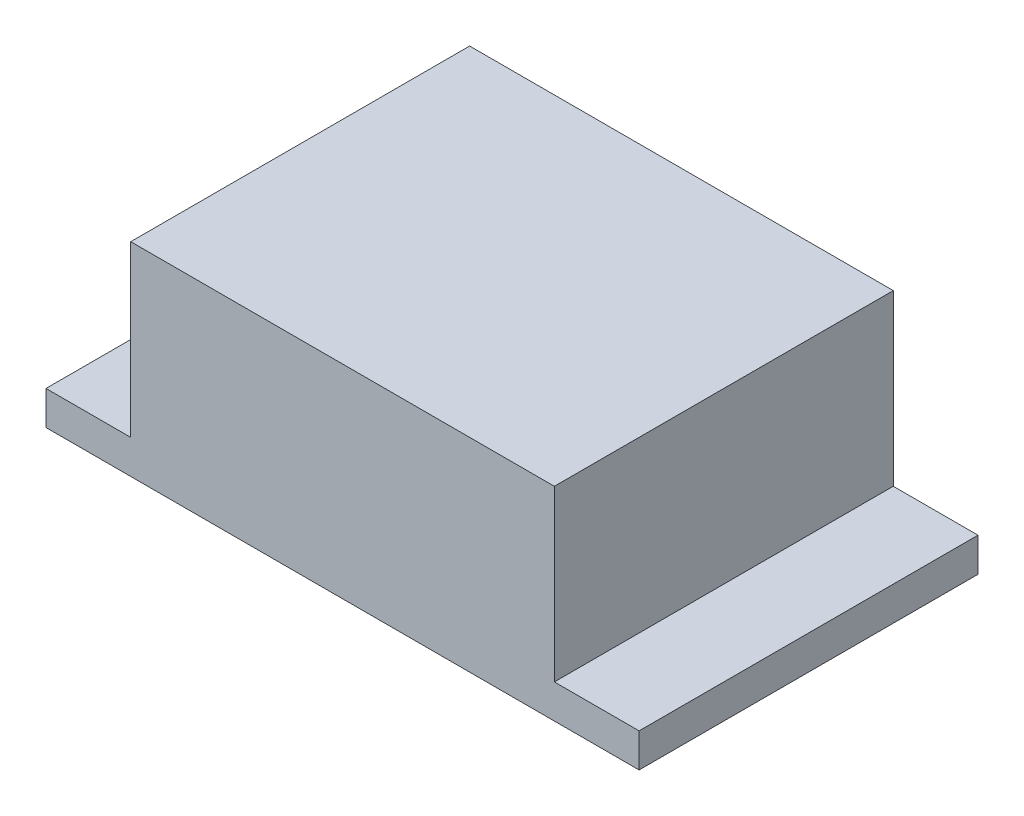
ISO-10303-21;
HEADER;
FILE_DESCRIPTION(('STEP AP214'),'2;1');
FILE_NAME('part.step','',(''),(''),'','','');
FILE_SCHEMA(('AUTOMOTIVE_DESIGN { 1 0 10303 214 1 1 1 1 }'));
ENDSEC;
DATA;
#1=APPLICATION_CONTEXT('core data for automotive mechanical design processes');
#2=APPLICATION_PROTOCOL_DEFINITION('international standard','automotive_design',2000,#1);
#3=PRODUCT_CONTEXT('',#1,'mechanical');
#4=PRODUCT('Part','Part','',(#3));
#5=PRODUCT_RELATED_PRODUCT_CATEGORY('part','',(#4));
#6=PRODUCT_DEFINITION_FORMATION('','',#4);
#7=PRODUCT_DEFINITION_CONTEXT('part definition',#1,'design');
#8=PRODUCT_DEFINITION('design','',#6,#7);
#9=PRODUCT_DEFINITION_SHAPE('','',#8);
#10=(LENGTH_UNIT() NAMED_UNIT(*) SI_UNIT(.MILLI.,.METRE.));
#11=(NAMED_UNIT(*) PLANE_ANGLE_UNIT() SI_UNIT($,.RADIAN.));
#12=(NAMED_UNIT(*) SI_UNIT($,.STERADIAN.) SOLID_ANGLE_UNIT());
#13=UNCERTAINTY_MEASURE_WITH_UNIT(LENGTH_MEASURE(1.E-05),#10,'distance_accuracy_value','');
#14=(GEOMETRIC_REPRESENTATION_CONTEXT(3) GLOBAL_UNCERTAINTY_ASSIGNED_CONTEXT((#13)) GLOBAL_UNIT_ASSIGNED_CONTEXT((#10,
#11,#12)) REPRESENTATION_CONTEXT('',''));
#15=CARTESIAN_POINT('',(0.,0.,0.));
#16=DIRECTION('',(0.,0.,1.));
#17=DIRECTION('',(1.,0.,0.));
#18=AXIS2_PLACEMENT_3D('',#15,#16,#17);
#19=CARTESIAN_POINT('',(0.,2.,0.));
#20=DIRECTION('',(0.,1.,0.));
#21=DIRECTION('',(0.,0.,1.));
#22=AXIS2_PLACEMENT_3D('',#19,#20,#21);
#23=PLANE('',#22);
#24=DIRECTION('',(0.,0.,-1.));
#25=VECTOR('',#24,1.);
#26=CARTESIAN_POINT('',(12.5,2.,-10.));
#27=LINE('',#26,#25);
#28=CARTESIAN_POINT('',(12.5,2.,10.));
#29=VERTEX_POINT('',#28);
#30=CARTESIAN_POINT('',(12.5,2.,-10.));
#31=VERTEX_POINT('',#30);
#32=EDGE_CURVE('E54',#29,#31,#27,.T.);
#33=ORIENTED_EDGE('',*,*,#32,.F.);
#34=DIRECTION('',(1.,0.,0.));
#35=VECTOR('',#34,1.);
#36=CARTESIAN_POINT('',(-17.5,2.,10.));
#37=LINE('',#36,#35);
#38=CARTESIAN_POINT('',(17.5,2.,10.));
#39=VERTEX_POINT('',#38);
#40=EDGE_CURVE('E143',#29,#39,#37,.T.);
#41=ORIENTED_EDGE('',*,*,#40,.T.);
#42=DIRECTION('',(0.,0.,-1.));
#43=VECTOR('',#42,1.);
#44=CARTESIAN_POINT('',(17.5,2.,-10.));
#45=LINE('',#44,#43);
#46=CARTESIAN_POINT('',(17.5,2.,-10.));
#47=VERTEX_POINT('',#46);
#48=EDGE_CURVE('E134',#39,#47,#45,.T.);
#49=ORIENTED_EDGE('',*,*,#48,.T.);
#50=DIRECTION('',(-1.,0.,0.));
#51=VECTOR('',#50,1.);
#52=CARTESIAN_POINT('',(-17.5,2.,-10.));
#53=LINE('',#52,#51);
#54=EDGE_CURVE('E139',#47,#31,#53,.T.);
#55=ORIENTED_EDGE('',*,*,#54,.T.);
#56=EDGE_LOOP('',(#33,#41,#49,#55));
#57=FACE_BOUND('',#56,.T.);
#58=ADVANCED_FACE('F39',(#57),#23,.T.);
#59=CARTESIAN_POINT('',(17.5,2.,-10.));
#60=DIRECTION('',(-1.,0.,0.));
#61=DIRECTION('',(0.,0.,1.));
#62=AXIS2_PLACEMENT_3D('',#59,#60,#61);
#63=PLANE('',#62);
#64=DIRECTION('',(0.,0.,-1.));
#65=VECTOR('',#64,1.);
#66=CARTESIAN_POINT('',(17.5,0.,-10.));
#67=LINE('',#66,#65);
#68=CARTESIAN_POINT('',(17.5,0.,10.));
#69=VERTEX_POINT('',#68);
#70=CARTESIAN_POINT('',(17.5,0.,-10.));
#71=VERTEX_POINT('',#70);
#72=EDGE_CURVE('E125',#69,#71,#67,.T.);
#73=ORIENTED_EDGE('',*,*,#72,.T.);
#74=DIRECTION('',(0.,-1.,0.));
#75=VECTOR('',#74,1.);
#76=CARTESIAN_POINT('',(17.5,2.,-10.));
#77=LINE('',#76,#75);
#78=EDGE_CURVE('E11',#47,#71,#77,.T.);
#79=ORIENTED_EDGE('',*,*,#78,.F.);
#80=ORIENTED_EDGE('',*,*,#48,.F.);
#81=DIRECTION('',(0.,-1.,0.));
#82=VECTOR('',#81,1.);
#83=CARTESIAN_POINT('',(17.5,2.,10.));
#84=LINE('',#83,#82);
#85=EDGE_CURVE('E145',#39,#69,#84,.T.);
#86=ORIENTED_EDGE('',*,*,#85,.T.);
#87=EDGE_LOOP('',(#73,#79,#80,#86));
#88=FACE_BOUND('',#87,.T.);
#89=ADVANCED_FACE('F41',(#88),#63,.F.);
#90=CARTESIAN_POINT('',(-17.5,2.,-10.));
#91=DIRECTION('',(0.,0.,1.));
#92=DIRECTION('',(1.,0.,0.));
#93=AXIS2_PLACEMENT_3D('',#90,#91,#92);
#94=PLANE('',#93);
#95=DIRECTION('',(-1.,0.,0.));
#96=VECTOR('',#95,1.);
#97=CARTESIAN_POINT('',(-17.5,0.,-10.));
#98=LINE('',#97,#96);
#99=CARTESIAN_POINT('',(-17.5,0.,-10.));
#100=VERTEX_POINT('',#99);
#101=EDGE_CURVE('E128',#71,#100,#98,.T.);
#102=ORIENTED_EDGE('',*,*,#101,.T.);
#103=DIRECTION('',(0.,-1.,0.));
#104=VECTOR('',#103,1.);
#105=CARTESIAN_POINT('',(-17.5,2.,-10.));
#106=LINE('',#105,#104);
#107=CARTESIAN_POINT('',(-17.5,2.,-10.));
#108=VERTEX_POINT('',#107);
#109=EDGE_CURVE('E47',#108,#100,#106,.T.);
#110=ORIENTED_EDGE('',*,*,#109,.F.);
#111=CARTESIAN_POINT('',(-12.5,2.,-10.));
#112=VERTEX_POINT('',#111);
#113=EDGE_CURVE('E137',#112,#108,#53,.T.);
#114=ORIENTED_EDGE('',*,*,#113,.F.);
#115=DIRECTION('',(0.,-1.,0.));
#116=VECTOR('',#115,1.);
#117=CARTESIAN_POINT('',(-12.5,12.,-10.));
#118=LINE('',#117,#116);
#119=CARTESIAN_POINT('',(-12.5,12.,-10.));
#120=VERTEX_POINT('',#119);
#121=EDGE_CURVE('E110',#120,#112,#118,.T.);
#122=ORIENTED_EDGE('',*,*,#121,.F.);
#123=DIRECTION('',(-1.,0.,0.));
#124=VECTOR('',#123,1.);
#125=CARTESIAN_POINT('',(-12.5,12.,-10.));
#126=LINE('',#125,#124);
#127=CARTESIAN_POINT('',(12.5,12.,-10.));
#128=VERTEX_POINT('',#127);
#129=EDGE_CURVE('E104',#128,#120,#126,.T.);
#130=ORIENTED_EDGE('',*,*,#129,.F.);
#131=DIRECTION('',(0.,-1.,0.));
#132=VECTOR('',#131,1.);
#133=CARTESIAN_POINT('',(12.5,12.,-10.));
#134=LINE('',#133,#132);
#135=EDGE_CURVE('E108',#128,#31,#134,.T.);
#136=ORIENTED_EDGE('',*,*,#135,.T.);
#137=ORIENTED_EDGE('',*,*,#54,.F.);
#138=ORIENTED_EDGE('',*,*,#78,.T.);
#139=EDGE_LOOP('',(#102,#110,#114,#122,#130,#136,#137,#138));
#140=FACE_BOUND('',#139,.T.);
#141=ADVANCED_FACE('F106',(#140),#94,.F.);
#142=CARTESIAN_POINT('',(-17.5,2.,-10.));
#143=DIRECTION('',(1.,0.,0.));
#144=DIRECTION('',(0.,0.,-1.));
#145=AXIS2_PLACEMENT_3D('',#142,#143,#144);
#146=PLANE('',#145);
#147=DIRECTION('',(0.,0.,1.));
#148=VECTOR('',#147,1.);
#149=CARTESIAN_POINT('',(-17.5,0.,-10.));
#150=LINE('',#149,#148);
#151=CARTESIAN_POINT('',(-17.5,0.,10.));
#152=VERTEX_POINT('',#151);
#153=EDGE_CURVE('E148',#100,#152,#150,.T.);
#154=ORIENTED_EDGE('',*,*,#153,.T.);
#155=DIRECTION('',(0.,-1.,0.));
#156=VECTOR('',#155,1.);
#157=CARTESIAN_POINT('',(-17.5,2.,10.));
#158=LINE('',#157,#156);
#159=CARTESIAN_POINT('',(-17.5,2.,10.));
#160=VERTEX_POINT('',#159);
#161=EDGE_CURVE('E153',#160,#152,#158,.T.);
#162=ORIENTED_EDGE('',*,*,#161,.F.);
#163=DIRECTION('',(0.,0.,1.));
#164=VECTOR('',#163,1.);
#165=CARTESIAN_POINT('',(-17.5,2.,-10.));
#166=LINE('',#165,#164);
#167=EDGE_CURVE('E141',#108,#160,#166,.T.);
#168=ORIENTED_EDGE('',*,*,#167,.F.);
#169=ORIENTED_EDGE('',*,*,#109,.T.);
#170=EDGE_LOOP('',(#154,#162,#168,#169));
#171=FACE_BOUND('',#170,.T.);
#172=ADVANCED_FACE('F160',(#171),#146,.F.);
#173=CARTESIAN_POINT('',(-17.5,2.,10.));
#174=DIRECTION('',(0.,0.,-1.));
#175=DIRECTION('',(-1.,0.,0.));
#176=AXIS2_PLACEMENT_3D('',#173,#174,#175);
#177=PLANE('',#176);
#178=DIRECTION('',(1.,0.,0.));
#179=VECTOR('',#178,1.);
#180=CARTESIAN_POINT('',(-17.5,0.,10.));
#181=LINE('',#180,#179);
#182=EDGE_CURVE('E138',#152,#69,#181,.T.);
#183=ORIENTED_EDGE('',*,*,#182,.T.);
#184=ORIENTED_EDGE('',*,*,#85,.F.);
#185=ORIENTED_EDGE('',*,*,#40,.F.);
#186=DIRECTION('',(0.,-1.,0.));
#187=VECTOR('',#186,1.);
#188=CARTESIAN_POINT('',(12.5,12.,10.));
#189=LINE('',#188,#187);
#190=CARTESIAN_POINT('',(12.5,12.,10.));
#191=VERTEX_POINT('',#190);
#192=EDGE_CURVE('E173',#191,#29,#189,.T.);
#193=ORIENTED_EDGE('',*,*,#192,.F.);
#194=DIRECTION('',(1.,0.,0.));
#195=VECTOR('',#194,1.);
#196=CARTESIAN_POINT('',(-12.5,12.,10.));
#197=LINE('',#196,#195);
#198=CARTESIAN_POINT('',(-12.5,12.,10.));
#199=VERTEX_POINT('',#198);
#200=EDGE_CURVE('E119',#199,#191,#197,.T.);
#201=ORIENTED_EDGE('',*,*,#200,.F.);
#202=DIRECTION('',(0.,-1.,0.));
#203=VECTOR('',#202,1.);
#204=CARTESIAN_POINT('',(-12.5,12.,10.));
#205=LINE('',#204,#203);
#206=CARTESIAN_POINT('',(-12.5,2.,10.));
#207=VERTEX_POINT('',#206);
#208=EDGE_CURVE('E130',#199,#207,#205,.T.);
#209=ORIENTED_EDGE('',*,*,#208,.T.);
#210=EDGE_CURVE('E144',#160,#207,#37,.T.);
#211=ORIENTED_EDGE('',*,*,#210,.F.);
#212=ORIENTED_EDGE('',*,*,#161,.T.);
#213=EDGE_LOOP('',(#183,#184,#185,#193,#201,#209,#211,#212));
#214=FACE_BOUND('',#213,.T.);
#215=ADVANCED_FACE('F168',(#214),#177,.F.);
#216=DIRECTION('',(0.,0.,1.));
#217=VECTOR('',#216,1.);
#218=CARTESIAN_POINT('',(-12.5,2.,-10.));
#219=LINE('',#218,#217);
#220=EDGE_CURVE('E62',#112,#207,#219,.T.);
#221=ORIENTED_EDGE('',*,*,#220,.F.);
#222=ORIENTED_EDGE('',*,*,#113,.T.);
#223=ORIENTED_EDGE('',*,*,#167,.T.);
#224=ORIENTED_EDGE('',*,*,#210,.T.);
#225=EDGE_LOOP('',(#221,#222,#223,#224));
#226=FACE_BOUND('',#225,.T.);
#227=ADVANCED_FACE('F183',(#226),#23,.T.);
#228=CARTESIAN_POINT('',(0.,0.,0.));
#229=DIRECTION('',(0.,1.,0.));
#230=DIRECTION('',(0.,0.,1.));
#231=AXIS2_PLACEMENT_3D('',#228,#229,#230);
#232=PLANE('',#231);
#233=ORIENTED_EDGE('',*,*,#72,.F.);
#234=ORIENTED_EDGE('',*,*,#182,.F.);
#235=ORIENTED_EDGE('',*,*,#153,.F.);
#236=ORIENTED_EDGE('',*,*,#101,.F.);
#237=EDGE_LOOP('',(#233,#234,#235,#236));
#238=FACE_BOUND('',#237,.T.);
#239=ADVANCED_FACE('F165',(#238),#232,.F.);
#240=CARTESIAN_POINT('',(12.5,12.,-10.));
#241=DIRECTION('',(-1.,0.,0.));
#242=DIRECTION('',(0.,0.,1.));
#243=AXIS2_PLACEMENT_3D('',#240,#241,#242);
#244=PLANE('',#243);
#245=ORIENTED_EDGE('',*,*,#32,.T.);
#246=ORIENTED_EDGE('',*,*,#135,.F.);
#247=DIRECTION('',(0.,0.,-1.));
#248=VECTOR('',#247,1.);
#249=CARTESIAN_POINT('',(12.5,12.,-10.));
#250=LINE('',#249,#248);
#251=EDGE_CURVE('E114',#191,#128,#250,.T.);
#252=ORIENTED_EDGE('',*,*,#251,.F.);
#253=ORIENTED_EDGE('',*,*,#192,.T.);
#254=EDGE_LOOP('',(#245,#246,#252,#253));
#255=FACE_BOUND('',#254,.T.);
#256=ADVANCED_FACE('F124',(#255),#244,.F.);
#257=CARTESIAN_POINT('',(-12.5,12.,-10.));
#258=DIRECTION('',(1.,0.,0.));
#259=DIRECTION('',(0.,0.,-1.));
#260=AXIS2_PLACEMENT_3D('',#257,#258,#259);
#261=PLANE('',#260);
#262=ORIENTED_EDGE('',*,*,#220,.T.);
#263=ORIENTED_EDGE('',*,*,#208,.F.);
#264=DIRECTION('',(0.,0.,1.));
#265=VECTOR('',#264,1.);
#266=CARTESIAN_POINT('',(-12.5,12.,-10.));
#267=LINE('',#266,#265);
#268=EDGE_CURVE('E113',#120,#199,#267,.T.);
#269=ORIENTED_EDGE('',*,*,#268,.F.);
#270=ORIENTED_EDGE('',*,*,#121,.T.);
#271=EDGE_LOOP('',(#262,#263,#269,#270));
#272=FACE_BOUND('',#271,.T.);
#273=ADVANCED_FACE('F182',(#272),#261,.F.);
#274=CARTESIAN_POINT('',(0.,12.,0.));
#275=DIRECTION('',(0.,1.,0.));
#276=DIRECTION('',(0.,0.,1.));
#277=AXIS2_PLACEMENT_3D('',#274,#275,#276);
#278=PLANE('',#277);
#279=ORIENTED_EDGE('',*,*,#251,.T.);
#280=ORIENTED_EDGE('',*,*,#129,.T.);
#281=ORIENTED_EDGE('',*,*,#268,.T.);
#282=ORIENTED_EDGE('',*,*,#200,.T.);
#283=EDGE_LOOP('',(#279,#280,#281,#282));
#284=FACE_BOUND('',#283,.T.);
#285=ADVANCED_FACE('F117',(#284),#278,.T.);
#286=CLOSED_SHELL('',(#58,#89,#141,#172,#215,#227,#239,#256,#273,#285));
#287=MANIFOLD_SOLID_BREP('B2',#286);
#288=ADVANCED_BREP_SHAPE_REPRESENTATION('',(#18,#287),#14);
#289=SHAPE_DEFINITION_REPRESENTATION(#9,#288);
ENDSEC;
END-ISO-10303-21;
